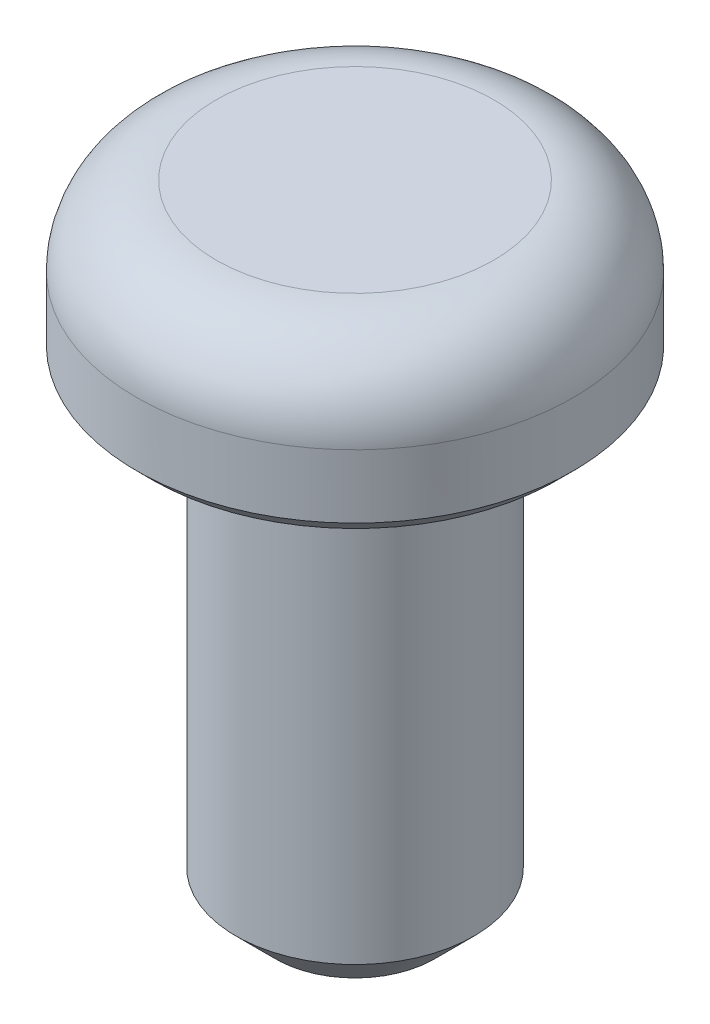
ISO-10303-21;
HEADER;
FILE_DESCRIPTION(('STEP AP214'),'2;1');
FILE_NAME('part.step','',(''),(''),'','','');
FILE_SCHEMA(('AUTOMOTIVE_DESIGN { 1 0 10303 214 1 1 1 1 }'));
ENDSEC;
DATA;
#1=APPLICATION_CONTEXT('core data for automotive mechanical design processes');
#2=APPLICATION_PROTOCOL_DEFINITION('international standard','automotive_design',2000,#1);
#3=PRODUCT_CONTEXT('',#1,'mechanical');
#4=PRODUCT('Part','Part','',(#3));
#5=PRODUCT_RELATED_PRODUCT_CATEGORY('part','',(#4));
#6=PRODUCT_DEFINITION_FORMATION('','',#4);
#7=PRODUCT_DEFINITION_CONTEXT('part definition',#1,'design');
#8=PRODUCT_DEFINITION('design','',#6,#7);
#9=PRODUCT_DEFINITION_SHAPE('','',#8);
#10=(LENGTH_UNIT() NAMED_UNIT(*) SI_UNIT(.MILLI.,.METRE.));
#11=(NAMED_UNIT(*) PLANE_ANGLE_UNIT() SI_UNIT($,.RADIAN.));
#12=(NAMED_UNIT(*) SI_UNIT($,.STERADIAN.) SOLID_ANGLE_UNIT());
#13=UNCERTAINTY_MEASURE_WITH_UNIT(LENGTH_MEASURE(1.E-05),#10,'distance_accuracy_value','');
#14=(GEOMETRIC_REPRESENTATION_CONTEXT(3) GLOBAL_UNCERTAINTY_ASSIGNED_CONTEXT((#13)) GLOBAL_UNIT_ASSIGNED_CONTEXT((#10,
#11,#12)) REPRESENTATION_CONTEXT('',''));
#15=CARTESIAN_POINT('',(0.,0.,0.));
#16=DIRECTION('',(0.,0.,1.));
#17=DIRECTION('',(1.,0.,0.));
#18=AXIS2_PLACEMENT_3D('',#15,#16,#17);
#19=CARTESIAN_POINT('',(1.5,0.,0.));
#20=DIRECTION('',(0.,-1.,0.));
#21=DIRECTION('',(0.,0.,-1.));
#22=AXIS2_PLACEMENT_3D('',#19,#20,#21);
#23=PLANE('',#22);
#24=CARTESIAN_POINT('',(0.,0.,0.));
#25=DIRECTION('',(0.,-1.,0.));
#26=DIRECTION('',(0.,0.,-1.));
#27=AXIS2_PLACEMENT_3D('',#24,#25,#26);
#28=CIRCLE('',#27,1.);
#29=CARTESIAN_POINT('',(0.,0.,-1.));
#30=VERTEX_POINT('',#29);
#31=EDGE_CURVE('E46',#30,#30,#28,.T.);
#32=ORIENTED_EDGE('',*,*,#31,.T.);
#33=EDGE_LOOP('',(#32));
#34=FACE_BOUND('',#33,.T.);
#35=ADVANCED_FACE('F31',(#34),#23,.T.);
#36=CARTESIAN_POINT('',(0.,8.,0.));
#37=DIRECTION('',(0.,1.,0.));
#38=DIRECTION('',(0.,0.,1.));
#39=AXIS2_PLACEMENT_3D('',#36,#37,#38);
#40=PLANE('',#39);
#41=CARTESIAN_POINT('',(0.,8.,0.));
#42=DIRECTION('',(0.,1.,0.));
#43=DIRECTION('',(0.,0.,1.));
#44=AXIS2_PLACEMENT_3D('',#41,#42,#43);
#45=CIRCLE('',#44,1.75);
#46=CARTESIAN_POINT('',(0.,8.,1.75));
#47=VERTEX_POINT('',#46);
#48=EDGE_CURVE('E51',#47,#47,#45,.T.);
#49=ORIENTED_EDGE('',*,*,#48,.T.);
#50=EDGE_LOOP('',(#49));
#51=FACE_BOUND('',#50,.T.);
#52=ADVANCED_FACE('F74',(#51),#40,.T.);
#53=CARTESIAN_POINT('',(0.,0.,0.));
#54=DIRECTION('',(0.,-1.,0.));
#55=DIRECTION('',(0.,0.,-1.));
#56=AXIS2_PLACEMENT_3D('',#53,#54,#55);
#57=CYLINDRICAL_SURFACE('',#56,2.75);
#58=CARTESIAN_POINT('',(0.,6.2,0.));
#59=DIRECTION('',(0.,-1.,0.));
#60=DIRECTION('',(0.,0.,-1.));
#61=AXIS2_PLACEMENT_3D('',#58,#59,#60);
#62=CIRCLE('',#61,2.75);
#63=CARTESIAN_POINT('',(0.,6.2,-2.75));
#64=VERTEX_POINT('',#63);
#65=EDGE_CURVE('E10',#64,#64,#62,.F.);
#66=ORIENTED_EDGE('',*,*,#65,.T.);
#67=EDGE_LOOP('',(#66));
#68=FACE_BOUND('',#67,.T.);
#69=CARTESIAN_POINT('',(0.,7.,0.));
#70=DIRECTION('',(0.,1.,0.));
#71=DIRECTION('',(0.,0.,1.));
#72=AXIS2_PLACEMENT_3D('',#69,#70,#71);
#73=CIRCLE('',#72,2.75);
#74=CARTESIAN_POINT('',(0.,7.,2.75));
#75=VERTEX_POINT('',#74);
#76=EDGE_CURVE('E54',#75,#75,#73,.F.);
#77=ORIENTED_EDGE('',*,*,#76,.T.);
#78=EDGE_LOOP('',(#77));
#79=FACE_BOUND('',#78,.T.);
#80=ADVANCED_FACE('F65',(#68,#79),#57,.T.);
#81=CARTESIAN_POINT('',(2.75,6.,0.));
#82=DIRECTION('',(0.,-1.,0.));
#83=DIRECTION('',(0.,0.,-1.));
#84=AXIS2_PLACEMENT_3D('',#81,#82,#83);
#85=PLANE('',#84);
#86=CARTESIAN_POINT('',(0.,6.,0.));
#87=DIRECTION('',(0.,-1.,0.));
#88=DIRECTION('',(0.,0.,-1.));
#89=AXIS2_PLACEMENT_3D('',#86,#87,#88);
#90=CIRCLE('',#89,2.55);
#91=CARTESIAN_POINT('',(0.,6.,-2.55));
#92=VERTEX_POINT('',#91);
#93=EDGE_CURVE('E38',#92,#92,#90,.T.);
#94=ORIENTED_EDGE('',*,*,#93,.T.);
#95=EDGE_LOOP('',(#94));
#96=FACE_BOUND('',#95,.T.);
#97=CARTESIAN_POINT('',(0.,6.,0.));
#98=DIRECTION('',(0.,-1.,0.));
#99=DIRECTION('',(0.,0.,-1.));
#100=AXIS2_PLACEMENT_3D('',#97,#98,#99);
#101=CIRCLE('',#100,1.5);
#102=CARTESIAN_POINT('',(0.,6.,-1.5));
#103=VERTEX_POINT('',#102);
#104=EDGE_CURVE('E57',#103,#103,#101,.T.);
#105=ORIENTED_EDGE('',*,*,#104,.F.);
#106=EDGE_LOOP('',(#105));
#107=FACE_BOUND('',#106,.T.);
#108=ADVANCED_FACE('F63',(#96,#107),#85,.T.);
#109=CARTESIAN_POINT('',(0.,0.,0.));
#110=DIRECTION('',(0.,-1.,0.));
#111=DIRECTION('',(0.,0.,-1.));
#112=AXIS2_PLACEMENT_3D('',#109,#110,#111);
#113=CYLINDRICAL_SURFACE('',#112,1.5);
#114=CARTESIAN_POINT('',(0.,0.500000000000002,0.));
#115=DIRECTION('',(0.,-1.,0.));
#116=DIRECTION('',(0.,0.,-1.));
#117=AXIS2_PLACEMENT_3D('',#114,#115,#116);
#118=CIRCLE('',#117,1.5);
#119=CARTESIAN_POINT('',(0.,0.500000000000002,-1.5));
#120=VERTEX_POINT('',#119);
#121=EDGE_CURVE('E42',#120,#120,#118,.F.);
#122=ORIENTED_EDGE('',*,*,#121,.T.);
#123=EDGE_LOOP('',(#122));
#124=FACE_BOUND('',#123,.T.);
#125=ORIENTED_EDGE('',*,*,#104,.T.);
#126=EDGE_LOOP('',(#125));
#127=FACE_BOUND('',#126,.T.);
#128=ADVANCED_FACE('F61',(#124,#127),#113,.T.);
#129=CARTESIAN_POINT('',(0.,7.,0.));
#130=DIRECTION('',(0.,1.,0.));
#131=DIRECTION('',(0.,0.,1.));
#132=AXIS2_PLACEMENT_3D('',#129,#130,#131);
#133=TOROIDAL_SURFACE('',#132,1.75,1.);
#134=ORIENTED_EDGE('',*,*,#48,.F.);
#135=EDGE_LOOP('',(#134));
#136=FACE_BOUND('',#135,.T.);
#137=ORIENTED_EDGE('',*,*,#76,.F.);
#138=EDGE_LOOP('',(#137));
#139=FACE_BOUND('',#138,.T.);
#140=ADVANCED_FACE('F71',(#136,#139),#133,.T.);
#141=CARTESIAN_POINT('',(0.,0.,0.));
#142=DIRECTION('',(0.,1.,0.));
#143=DIRECTION('',(0.,0.,1.));
#144=AXIS2_PLACEMENT_3D('',#141,#142,#143);
#145=CONICAL_SURFACE('',#144,1.,0.785398163397445);
#146=ORIENTED_EDGE('',*,*,#121,.F.);
#147=EDGE_LOOP('',(#146));
#148=FACE_BOUND('',#147,.T.);
#149=ORIENTED_EDGE('',*,*,#31,.F.);
#150=EDGE_LOOP('',(#149));
#151=FACE_BOUND('',#150,.T.);
#152=ADVANCED_FACE('F86',(#148,#151),#145,.T.);
#153=CARTESIAN_POINT('',(0.,6.,0.));
#154=DIRECTION('',(0.,1.,0.));
#155=DIRECTION('',(0.,0.,1.));
#156=AXIS2_PLACEMENT_3D('',#153,#154,#155);
#157=CONICAL_SURFACE('',#156,2.55,0.785398163397446);
#158=ORIENTED_EDGE('',*,*,#65,.F.);
#159=EDGE_LOOP('',(#158));
#160=FACE_BOUND('',#159,.T.);
#161=ORIENTED_EDGE('',*,*,#93,.F.);
#162=EDGE_LOOP('',(#161));
#163=FACE_BOUND('',#162,.T.);
#164=ADVANCED_FACE('F33',(#160,#163),#157,.T.);
#165=CLOSED_SHELL('',(#35,#52,#80,#108,#128,#140,#152,#164));
#166=MANIFOLD_SOLID_BREP('B2',#165);
#167=ADVANCED_BREP_SHAPE_REPRESENTATION('',(#18,#166),#14);
#168=SHAPE_DEFINITION_REPRESENTATION(#9,#167);
ENDSEC;
END-ISO-10303-21;
